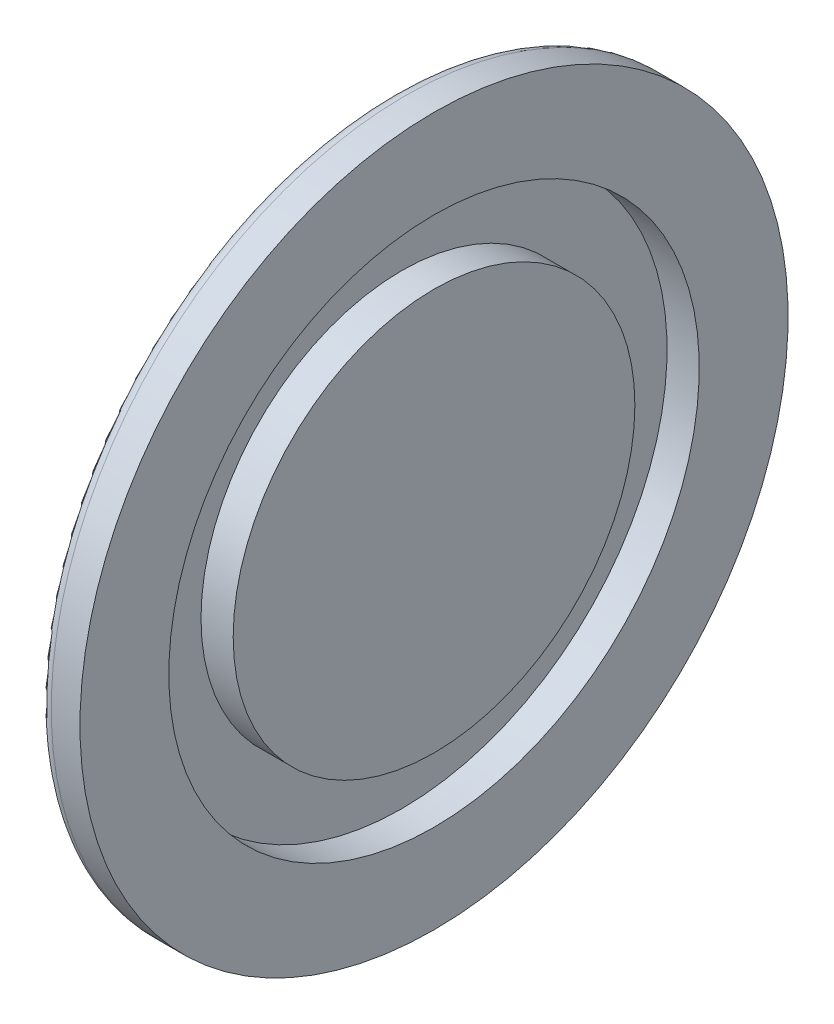
ISO-10303-21;
HEADER;
FILE_DESCRIPTION(('STEP AP214'),'2;1');
FILE_NAME('part.step','',(''),(''),'','','');
FILE_SCHEMA(('AUTOMOTIVE_DESIGN { 1 0 10303 214 1 1 1 1 }'));
ENDSEC;
DATA;
#1=APPLICATION_CONTEXT('core data for automotive mechanical design processes');
#2=APPLICATION_PROTOCOL_DEFINITION('international standard','automotive_design',2000,#1);
#3=PRODUCT_CONTEXT('',#1,'mechanical');
#4=PRODUCT('Part','Part','',(#3));
#5=PRODUCT_RELATED_PRODUCT_CATEGORY('part','',(#4));
#6=PRODUCT_DEFINITION_FORMATION('','',#4);
#7=PRODUCT_DEFINITION_CONTEXT('part definition',#1,'design');
#8=PRODUCT_DEFINITION('design','',#6,#7);
#9=PRODUCT_DEFINITION_SHAPE('','',#8);
#10=(LENGTH_UNIT() NAMED_UNIT(*) SI_UNIT(.MILLI.,.METRE.));
#11=(NAMED_UNIT(*) PLANE_ANGLE_UNIT() SI_UNIT($,.RADIAN.));
#12=(NAMED_UNIT(*) SI_UNIT($,.STERADIAN.) SOLID_ANGLE_UNIT());
#13=UNCERTAINTY_MEASURE_WITH_UNIT(LENGTH_MEASURE(1.E-05),#10,'distance_accuracy_value','');
#14=(GEOMETRIC_REPRESENTATION_CONTEXT(3) GLOBAL_UNCERTAINTY_ASSIGNED_CONTEXT((#13)) GLOBAL_UNIT_ASSIGNED_CONTEXT((#10,
#11,#12)) REPRESENTATION_CONTEXT('',''));
#15=CARTESIAN_POINT('',(0.,0.,0.));
#16=DIRECTION('',(0.,0.,1.));
#17=DIRECTION('',(1.,0.,0.));
#18=AXIS2_PLACEMENT_3D('',#15,#16,#17);
#19=CARTESIAN_POINT('',(1.,0.,0.));
#20=DIRECTION('',(1.,0.,0.));
#21=DIRECTION('',(0.,0.,-1.));
#22=AXIS2_PLACEMENT_3D('',#19,#20,#21);
#23=TOROIDAL_SURFACE('',#22,19.9042458872749,1.);
#24=CARTESIAN_POINT('',(0.,0.,0.));
#25=DIRECTION('',(1.,0.,0.));
#26=DIRECTION('',(0.,-1.,0.));
#27=AXIS2_PLACEMENT_3D('',#24,#25,#26);
#28=CIRCLE('',#27,19.9042458872749);
#29=CARTESIAN_POINT('',(0.,19.9042458872749,0.));
#30=VERTEX_POINT('',#29);
#31=EDGE_CURVE('E11',#30,#30,#28,.T.);
#32=ORIENTED_EDGE('',*,*,#31,.T.);
#33=EDGE_LOOP('',(#32));
#34=FACE_BOUND('',#33,.T.);
#35=CARTESIAN_POINT('',(0.0340741737109344,0.,0.));
#36=DIRECTION('',(-1.,0.,0.));
#37=DIRECTION('',(0.,-1.,0.));
#38=AXIS2_PLACEMENT_3D('',#35,#36,#37);
#39=CIRCLE('',#38,20.1630649323774);
#40=CARTESIAN_POINT('',(0.0340741737109321,20.1630649323774,0.));
#41=VERTEX_POINT('',#40);
#42=EDGE_CURVE('E26',#41,#41,#39,.T.);
#43=ORIENTED_EDGE('',*,*,#42,.T.);
#44=EDGE_LOOP('',(#43));
#45=FACE_BOUND('',#44,.T.);
#46=ADVANCED_FACE('F16',(#34,#45),#23,.T.);
#47=CARTESIAN_POINT('',(1.,0.,0.));
#48=DIRECTION('',(1.,0.,0.));
#49=DIRECTION('',(0.,1.,0.));
#50=AXIS2_PLACEMENT_3D('',#47,#48,#49);
#51=CONICAL_SURFACE('',#50,23.7679491924311,1.308996939);
#52=CARTESIAN_POINT('',(1.80140116168989,0.,0.));
#53=DIRECTION('',(1.,0.,0.));
#54=DIRECTION('',(0.,-1.,0.));
#55=AXIS2_PLACEMENT_3D('',#52,#53,#54);
#56=CIRCLE('',#55,26.7588190451025);
#57=CARTESIAN_POINT('',(1.80140116168989,26.7588190451025,0.));
#58=VERTEX_POINT('',#57);
#59=EDGE_CURVE('E95',#58,#58,#56,.T.);
#60=ORIENTED_EDGE('',*,*,#59,.F.);
#61=EDGE_LOOP('',(#60));
#62=FACE_BOUND('',#61,.T.);
#63=ORIENTED_EDGE('',*,*,#42,.F.);
#64=EDGE_LOOP('',(#63));
#65=FACE_BOUND('',#64,.T.);
#66=ADVANCED_FACE('F134',(#62,#65),#51,.T.);
#67=CARTESIAN_POINT('',(0.,20.0358983848623,0.));
#68=DIRECTION('',(-1.,0.,0.));
#69=DIRECTION('',(0.,1.,0.));
#70=AXIS2_PLACEMENT_3D('',#67,#68,#69);
#71=PLANE('',#70);
#72=ORIENTED_EDGE('',*,*,#31,.F.);
#73=EDGE_LOOP('',(#72));
#74=FACE_BOUND('',#73,.T.);
#75=ADVANCED_FACE('F128',(#74),#71,.T.);
#76=CARTESIAN_POINT('',(2.76732698797896,0.,0.));
#77=DIRECTION('',(1.,0.,0.));
#78=DIRECTION('',(0.,0.,-1.));
#79=AXIS2_PLACEMENT_3D('',#76,#77,#78);
#80=TOROIDAL_SURFACE('',#79,26.5,1.);
#81=ORIENTED_EDGE('',*,*,#59,.T.);
#82=EDGE_LOOP('',(#81));
#83=FACE_BOUND('',#82,.T.);
#84=CARTESIAN_POINT('',(2.76732698797896,0.,0.));
#85=DIRECTION('',(-1.,0.,0.));
#86=DIRECTION('',(0.,-1.,0.));
#87=AXIS2_PLACEMENT_3D('',#84,#85,#86);
#88=CIRCLE('',#87,27.5);
#89=CARTESIAN_POINT('',(2.76732698797896,27.5,0.));
#90=VERTEX_POINT('',#89);
#91=EDGE_CURVE('E90',#90,#90,#88,.T.);
#92=ORIENTED_EDGE('',*,*,#91,.T.);
#93=EDGE_LOOP('',(#92));
#94=FACE_BOUND('',#93,.T.);
#95=ADVANCED_FACE('F115',(#83,#94),#80,.T.);
#96=CARTESIAN_POINT('',(3.5,0.,0.));
#97=DIRECTION('',(1.,0.,0.));
#98=DIRECTION('',(0.,1.,0.));
#99=AXIS2_PLACEMENT_3D('',#96,#97,#98);
#100=CYLINDRICAL_SURFACE('',#99,27.5);
#101=CARTESIAN_POINT('',(5.,0.,0.));
#102=DIRECTION('',(1.,0.,0.));
#103=DIRECTION('',(0.,0.,-1.));
#104=AXIS2_PLACEMENT_3D('',#101,#102,#103);
#105=CIRCLE('',#104,27.5);
#106=CARTESIAN_POINT('',(5.,27.5,0.));
#107=VERTEX_POINT('',#106);
#108=EDGE_CURVE('E20',#107,#107,#105,.T.);
#109=ORIENTED_EDGE('',*,*,#108,.F.);
#110=EDGE_LOOP('',(#109));
#111=FACE_BOUND('',#110,.T.);
#112=ORIENTED_EDGE('',*,*,#91,.F.);
#113=EDGE_LOOP('',(#112));
#114=FACE_BOUND('',#113,.T.);
#115=ADVANCED_FACE('F117',(#111,#114),#100,.T.);
#116=CARTESIAN_POINT('',(5.,20.6,0.));
#117=DIRECTION('',(1.,0.,0.));
#118=DIRECTION('',(0.,1.,0.));
#119=AXIS2_PLACEMENT_3D('',#116,#117,#118);
#120=PLANE('',#119);
#121=ORIENTED_EDGE('',*,*,#108,.T.);
#122=EDGE_LOOP('',(#121));
#123=FACE_BOUND('',#122,.T.);
#124=CARTESIAN_POINT('',(5.,0.,0.));
#125=DIRECTION('',(1.,0.,0.));
#126=DIRECTION('',(0.,0.,-1.));
#127=AXIS2_PLACEMENT_3D('',#124,#125,#126);
#128=CIRCLE('',#127,20.6);
#129=CARTESIAN_POINT('',(5.,20.6,0.));
#130=VERTEX_POINT('',#129);
#131=EDGE_CURVE('E78',#130,#130,#128,.T.);
#132=ORIENTED_EDGE('',*,*,#131,.F.);
#133=EDGE_LOOP('',(#132));
#134=FACE_BOUND('',#133,.T.);
#135=ADVANCED_FACE('F79',(#123,#134),#120,.T.);
#136=CARTESIAN_POINT('',(3.75,0.,0.));
#137=DIRECTION('',(1.,0.,0.));
#138=DIRECTION('',(0.,1.,0.));
#139=AXIS2_PLACEMENT_3D('',#136,#137,#138);
#140=CYLINDRICAL_SURFACE('',#139,20.6);
#141=ORIENTED_EDGE('',*,*,#131,.T.);
#142=EDGE_LOOP('',(#141));
#143=FACE_BOUND('',#142,.T.);
#144=CARTESIAN_POINT('',(2.5,0.,0.));
#145=DIRECTION('',(1.,0.,0.));
#146=DIRECTION('',(0.,0.,-1.));
#147=AXIS2_PLACEMENT_3D('',#144,#145,#146);
#148=CIRCLE('',#147,20.6);
#149=CARTESIAN_POINT('',(2.5,20.6,0.));
#150=VERTEX_POINT('',#149);
#151=EDGE_CURVE('E82',#150,#150,#148,.T.);
#152=ORIENTED_EDGE('',*,*,#151,.F.);
#153=EDGE_LOOP('',(#152));
#154=FACE_BOUND('',#153,.T.);
#155=ADVANCED_FACE('F18',(#143,#154),#140,.F.);
#156=CARTESIAN_POINT('',(2.5,15.6,0.));
#157=DIRECTION('',(1.,0.,0.));
#158=DIRECTION('',(0.,1.,0.));
#159=AXIS2_PLACEMENT_3D('',#156,#157,#158);
#160=PLANE('',#159);
#161=ORIENTED_EDGE('',*,*,#151,.T.);
#162=EDGE_LOOP('',(#161));
#163=FACE_BOUND('',#162,.T.);
#164=CARTESIAN_POINT('',(2.5,0.,0.));
#165=DIRECTION('',(1.,0.,0.));
#166=DIRECTION('',(0.,0.,-1.));
#167=AXIS2_PLACEMENT_3D('',#164,#165,#166);
#168=CIRCLE('',#167,15.6);
#169=CARTESIAN_POINT('',(2.5,15.6,0.));
#170=VERTEX_POINT('',#169);
#171=EDGE_CURVE('E66',#170,#170,#168,.T.);
#172=ORIENTED_EDGE('',*,*,#171,.F.);
#173=EDGE_LOOP('',(#172));
#174=FACE_BOUND('',#173,.T.);
#175=ADVANCED_FACE('F145',(#163,#174),#160,.T.);
#176=CARTESIAN_POINT('',(3.75,0.,0.));
#177=DIRECTION('',(1.,0.,0.));
#178=DIRECTION('',(0.,1.,0.));
#179=AXIS2_PLACEMENT_3D('',#176,#177,#178);
#180=CYLINDRICAL_SURFACE('',#179,15.6);
#181=ORIENTED_EDGE('',*,*,#171,.T.);
#182=EDGE_LOOP('',(#181));
#183=FACE_BOUND('',#182,.T.);
#184=CARTESIAN_POINT('',(5.,0.,0.));
#185=DIRECTION('',(1.,0.,0.));
#186=DIRECTION('',(0.,0.,-1.));
#187=AXIS2_PLACEMENT_3D('',#184,#185,#186);
#188=CIRCLE('',#187,15.6);
#189=CARTESIAN_POINT('',(5.,15.6,0.));
#190=VERTEX_POINT('',#189);
#191=EDGE_CURVE('E56',#190,#190,#188,.T.);
#192=ORIENTED_EDGE('',*,*,#191,.F.);
#193=EDGE_LOOP('',(#192));
#194=FACE_BOUND('',#193,.T.);
#195=ADVANCED_FACE('F147',(#183,#194),#180,.T.);
#196=CARTESIAN_POINT('',(5.,0.,0.));
#197=DIRECTION('',(1.,0.,0.));
#198=DIRECTION('',(0.,1.,0.));
#199=AXIS2_PLACEMENT_3D('',#196,#197,#198);
#200=PLANE('',#199);
#201=ORIENTED_EDGE('',*,*,#191,.T.);
#202=EDGE_LOOP('',(#201));
#203=FACE_BOUND('',#202,.T.);
#204=ADVANCED_FACE('F153',(#203),#200,.T.);
#205=CLOSED_SHELL('',(#46,#66,#75,#95,#115,#135,#155,#175,#195,#204));
#206=MANIFOLD_SOLID_BREP('B1',#205);
#207=ADVANCED_BREP_SHAPE_REPRESENTATION('',(#18,#206),#14);
#208=SHAPE_DEFINITION_REPRESENTATION(#9,#207);
ENDSEC;
END-ISO-10303-21;
